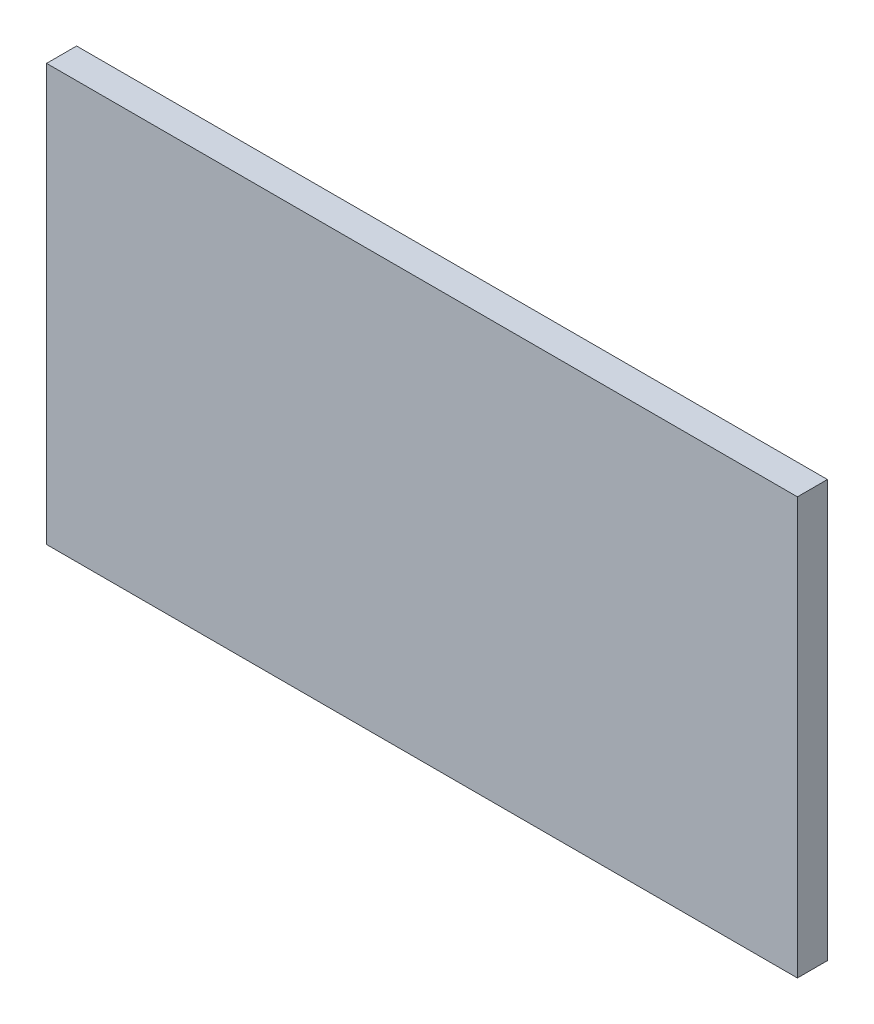
ISO-10303-21;
HEADER;
FILE_DESCRIPTION(('STEP AP214'),'2;1');
FILE_NAME('part.step','',(''),(''),'','','');
FILE_SCHEMA(('AUTOMOTIVE_DESIGN { 1 0 10303 214 1 1 1 1 }'));
ENDSEC;
DATA;
#1=APPLICATION_CONTEXT('core data for automotive mechanical design processes');
#2=APPLICATION_PROTOCOL_DEFINITION('international standard','automotive_design',2000,#1);
#3=PRODUCT_CONTEXT('',#1,'mechanical');
#4=PRODUCT('Part','Part','',(#3));
#5=PRODUCT_RELATED_PRODUCT_CATEGORY('part','',(#4));
#6=PRODUCT_DEFINITION_FORMATION('','',#4);
#7=PRODUCT_DEFINITION_CONTEXT('part definition',#1,'design');
#8=PRODUCT_DEFINITION('design','',#6,#7);
#9=PRODUCT_DEFINITION_SHAPE('','',#8);
#10=(LENGTH_UNIT() NAMED_UNIT(*) SI_UNIT(.MILLI.,.METRE.));
#11=(NAMED_UNIT(*) PLANE_ANGLE_UNIT() SI_UNIT($,.RADIAN.));
#12=(NAMED_UNIT(*) SI_UNIT($,.STERADIAN.) SOLID_ANGLE_UNIT());
#13=UNCERTAINTY_MEASURE_WITH_UNIT(LENGTH_MEASURE(1.E-05),#10,'distance_accuracy_value','');
#14=(GEOMETRIC_REPRESENTATION_CONTEXT(3) GLOBAL_UNCERTAINTY_ASSIGNED_CONTEXT((#13)) GLOBAL_UNIT_ASSIGNED_CONTEXT((#10,
#11,#12)) REPRESENTATION_CONTEXT('',''));
#15=CARTESIAN_POINT('',(0.,0.,0.));
#16=DIRECTION('',(0.,0.,1.));
#17=DIRECTION('',(1.,0.,0.));
#18=AXIS2_PLACEMENT_3D('',#15,#16,#17);
#19=CARTESIAN_POINT('',(-500.,4.99999999999738,40.));
#20=DIRECTION('',(0.,1.,0.));
#21=DIRECTION('',(0.,0.,1.));
#22=AXIS2_PLACEMENT_3D('',#19,#20,#21);
#23=PLANE('',#22);
#24=DIRECTION('',(1.,0.,0.));
#25=VECTOR('',#24,1.);
#26=CARTESIAN_POINT('',(-500.,4.99999999999738,0.));
#27=LINE('',#26,#25);
#28=CARTESIAN_POINT('',(-500.,4.99999999999738,0.));
#29=VERTEX_POINT('',#28);
#30=CARTESIAN_POINT('',(499.999999999986,4.99999999999738,0.));
#31=VERTEX_POINT('',#30);
#32=EDGE_CURVE('E104',#29,#31,#27,.T.);
#33=ORIENTED_EDGE('',*,*,#32,.F.);
#34=DIRECTION('',(0.,0.,-1.));
#35=VECTOR('',#34,1.);
#36=CARTESIAN_POINT('',(-500.,4.99999999999738,40.));
#37=LINE('',#36,#35);
#38=CARTESIAN_POINT('',(-500.,4.99999999999738,40.));
#39=VERTEX_POINT('',#38);
#40=EDGE_CURVE('E11',#39,#29,#37,.T.);
#41=ORIENTED_EDGE('',*,*,#40,.F.);
#42=DIRECTION('',(1.,0.,0.));
#43=VECTOR('',#42,1.);
#44=CARTESIAN_POINT('',(-500.,4.99999999999738,40.));
#45=LINE('',#44,#43);
#46=CARTESIAN_POINT('',(499.999999999986,4.99999999999738,40.));
#47=VERTEX_POINT('',#46);
#48=EDGE_CURVE('E99',#39,#47,#45,.T.);
#49=ORIENTED_EDGE('',*,*,#48,.T.);
#50=DIRECTION('',(0.,0.,-1.));
#51=VECTOR('',#50,1.);
#52=CARTESIAN_POINT('',(499.999999999986,4.99999999999738,40.));
#53=LINE('',#52,#51);
#54=EDGE_CURVE('E42',#47,#31,#53,.T.);
#55=ORIENTED_EDGE('',*,*,#54,.T.);
#56=EDGE_LOOP('',(#33,#41,#49,#55));
#57=FACE_BOUND('',#56,.T.);
#58=ADVANCED_FACE('F39',(#57),#23,.T.);
#59=CARTESIAN_POINT('',(-500.,4.99999999999738,40.));
#60=DIRECTION('',(1.,0.,0.));
#61=DIRECTION('',(0.,0.,-1.));
#62=AXIS2_PLACEMENT_3D('',#59,#60,#61);
#63=PLANE('',#62);
#64=DIRECTION('',(0.,-1.,0.));
#65=VECTOR('',#64,1.);
#66=CARTESIAN_POINT('',(-500.,4.99999999999738,0.));
#67=LINE('',#66,#65);
#68=CARTESIAN_POINT('',(-500.,-550.,0.));
#69=VERTEX_POINT('',#68);
#70=EDGE_CURVE('E72',#29,#69,#67,.T.);
#71=ORIENTED_EDGE('',*,*,#70,.T.);
#72=DIRECTION('',(0.,0.,-1.));
#73=VECTOR('',#72,1.);
#74=CARTESIAN_POINT('',(-500.,-550.,40.));
#75=LINE('',#74,#73);
#76=CARTESIAN_POINT('',(-500.,-550.,40.));
#77=VERTEX_POINT('',#76);
#78=EDGE_CURVE('E48',#77,#69,#75,.T.);
#79=ORIENTED_EDGE('',*,*,#78,.F.);
#80=DIRECTION('',(0.,-1.,0.));
#81=VECTOR('',#80,1.);
#82=CARTESIAN_POINT('',(-500.,4.99999999999738,40.));
#83=LINE('',#82,#81);
#84=EDGE_CURVE('E89',#39,#77,#83,.T.);
#85=ORIENTED_EDGE('',*,*,#84,.F.);
#86=ORIENTED_EDGE('',*,*,#40,.T.);
#87=EDGE_LOOP('',(#71,#79,#85,#86));
#88=FACE_BOUND('',#87,.T.);
#89=ADVANCED_FACE('F114',(#88),#63,.F.);
#90=CARTESIAN_POINT('',(-500.,-550.,40.));
#91=DIRECTION('',(0.,1.,0.));
#92=DIRECTION('',(0.,0.,1.));
#93=AXIS2_PLACEMENT_3D('',#90,#91,#92);
#94=PLANE('',#93);
#95=DIRECTION('',(1.,0.,0.));
#96=VECTOR('',#95,1.);
#97=CARTESIAN_POINT('',(-500.,-550.,0.));
#98=LINE('',#97,#96);
#99=CARTESIAN_POINT('',(499.999999999986,-550.,0.));
#100=VERTEX_POINT('',#99);
#101=EDGE_CURVE('E96',#69,#100,#98,.T.);
#102=ORIENTED_EDGE('',*,*,#101,.T.);
#103=DIRECTION('',(0.,0.,-1.));
#104=VECTOR('',#103,1.);
#105=CARTESIAN_POINT('',(499.999999999986,-550.,40.));
#106=LINE('',#105,#104);
#107=CARTESIAN_POINT('',(499.999999999986,-550.,40.));
#108=VERTEX_POINT('',#107);
#109=EDGE_CURVE('E93',#108,#100,#106,.T.);
#110=ORIENTED_EDGE('',*,*,#109,.F.);
#111=DIRECTION('',(1.,0.,0.));
#112=VECTOR('',#111,1.);
#113=CARTESIAN_POINT('',(-500.,-550.,40.));
#114=LINE('',#113,#112);
#115=EDGE_CURVE('E84',#77,#108,#114,.T.);
#116=ORIENTED_EDGE('',*,*,#115,.F.);
#117=ORIENTED_EDGE('',*,*,#78,.T.);
#118=EDGE_LOOP('',(#102,#110,#116,#117));
#119=FACE_BOUND('',#118,.T.);
#120=ADVANCED_FACE('F94',(#119),#94,.F.);
#121=CARTESIAN_POINT('',(499.999999999986,4.99999999999738,40.));
#122=DIRECTION('',(1.,0.,0.));
#123=DIRECTION('',(0.,1.,0.));
#124=AXIS2_PLACEMENT_3D('',#121,#122,#123);
#125=PLANE('',#124);
#126=DIRECTION('',(0.,-1.,0.));
#127=VECTOR('',#126,1.);
#128=CARTESIAN_POINT('',(499.999999999986,4.99999999999738,0.));
#129=LINE('',#128,#127);
#130=EDGE_CURVE('E107',#31,#100,#129,.T.);
#131=ORIENTED_EDGE('',*,*,#130,.F.);
#132=ORIENTED_EDGE('',*,*,#54,.F.);
#133=DIRECTION('',(0.,-1.,0.));
#134=VECTOR('',#133,1.);
#135=CARTESIAN_POINT('',(499.999999999986,4.99999999999738,40.));
#136=LINE('',#135,#134);
#137=EDGE_CURVE('E88',#47,#108,#136,.T.);
#138=ORIENTED_EDGE('',*,*,#137,.T.);
#139=ORIENTED_EDGE('',*,*,#109,.T.);
#140=EDGE_LOOP('',(#131,#132,#138,#139));
#141=FACE_BOUND('',#140,.T.);
#142=ADVANCED_FACE('F98',(#141),#125,.T.);
#143=CARTESIAN_POINT('',(0.,0.,40.));
#144=DIRECTION('',(0.,0.,-1.));
#145=DIRECTION('',(-1.,0.,0.));
#146=AXIS2_PLACEMENT_3D('',#143,#144,#145);
#147=PLANE('',#146);
#148=ORIENTED_EDGE('',*,*,#48,.F.);
#149=ORIENTED_EDGE('',*,*,#84,.T.);
#150=ORIENTED_EDGE('',*,*,#115,.T.);
#151=ORIENTED_EDGE('',*,*,#137,.F.);
#152=EDGE_LOOP('',(#148,#149,#150,#151));
#153=FACE_BOUND('',#152,.T.);
#154=ADVANCED_FACE('F87',(#153),#147,.F.);
#155=CARTESIAN_POINT('',(0.,0.,0.));
#156=DIRECTION('',(0.,0.,-1.));
#157=DIRECTION('',(-1.,0.,0.));
#158=AXIS2_PLACEMENT_3D('',#155,#156,#157);
#159=PLANE('',#158);
#160=ORIENTED_EDGE('',*,*,#32,.T.);
#161=ORIENTED_EDGE('',*,*,#130,.T.);
#162=ORIENTED_EDGE('',*,*,#101,.F.);
#163=ORIENTED_EDGE('',*,*,#70,.F.);
#164=EDGE_LOOP('',(#160,#161,#162,#163));
#165=FACE_BOUND('',#164,.T.);
#166=ADVANCED_FACE('F112',(#165),#159,.T.);
#167=CLOSED_SHELL('',(#58,#89,#120,#142,#154,#166));
#168=MANIFOLD_SOLID_BREP('B2',#167);
#169=ADVANCED_BREP_SHAPE_REPRESENTATION('',(#18,#168),#14);
#170=SHAPE_DEFINITION_REPRESENTATION(#9,#169);
ENDSEC;
END-ISO-10303-21;
